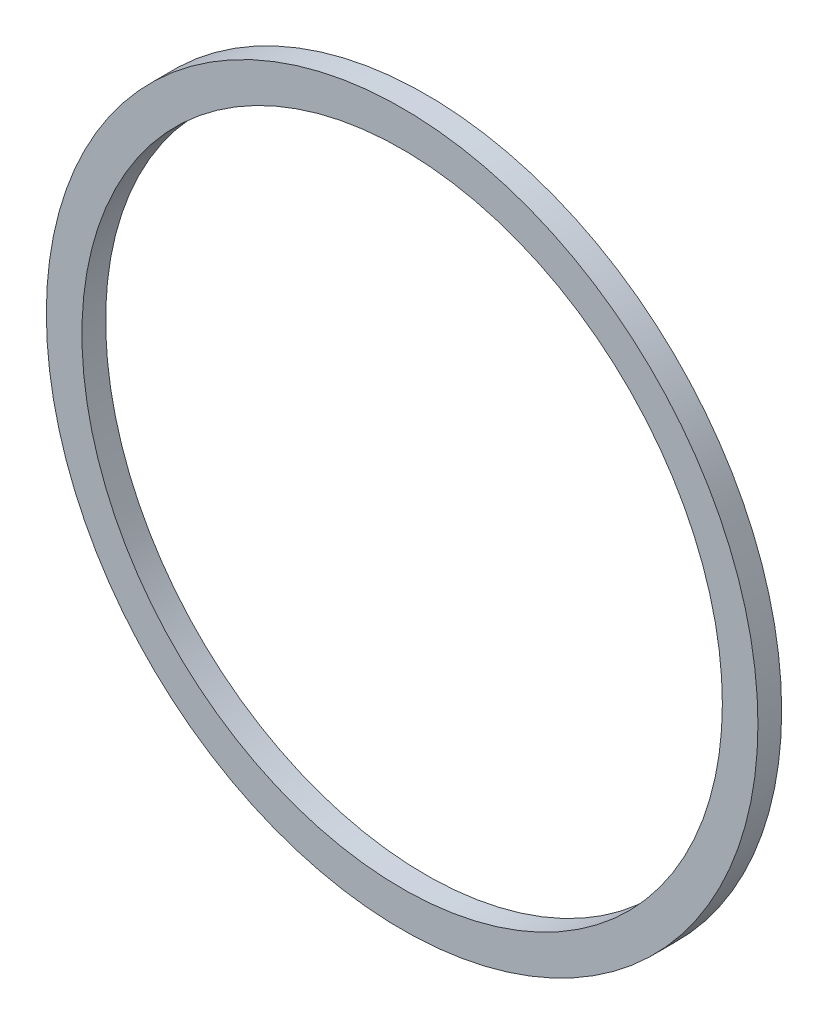
ISO-10303-21;
HEADER;
FILE_DESCRIPTION(('STEP AP214'),'2;1');
FILE_NAME('part.step','',(''),(''),'','','');
FILE_SCHEMA(('AUTOMOTIVE_DESIGN { 1 0 10303 214 1 1 1 1 }'));
ENDSEC;
DATA;
#1=APPLICATION_CONTEXT('core data for automotive mechanical design processes');
#2=APPLICATION_PROTOCOL_DEFINITION('international standard','automotive_design',2000,#1);
#3=PRODUCT_CONTEXT('',#1,'mechanical');
#4=PRODUCT('Part','Part','',(#3));
#5=PRODUCT_RELATED_PRODUCT_CATEGORY('part','',(#4));
#6=PRODUCT_DEFINITION_FORMATION('','',#4);
#7=PRODUCT_DEFINITION_CONTEXT('part definition',#1,'design');
#8=PRODUCT_DEFINITION('design','',#6,#7);
#9=PRODUCT_DEFINITION_SHAPE('','',#8);
#10=(LENGTH_UNIT() NAMED_UNIT(*) SI_UNIT(.MILLI.,.METRE.));
#11=(NAMED_UNIT(*) PLANE_ANGLE_UNIT() SI_UNIT($,.RADIAN.));
#12=(NAMED_UNIT(*) SI_UNIT($,.STERADIAN.) SOLID_ANGLE_UNIT());
#13=UNCERTAINTY_MEASURE_WITH_UNIT(LENGTH_MEASURE(1.E-05),#10,'distance_accuracy_value','');
#14=(GEOMETRIC_REPRESENTATION_CONTEXT(3) GLOBAL_UNCERTAINTY_ASSIGNED_CONTEXT((#13)) GLOBAL_UNIT_ASSIGNED_CONTEXT((#10,
#11,#12)) REPRESENTATION_CONTEXT('',''));
#15=CARTESIAN_POINT('',(0.,0.,0.));
#16=DIRECTION('',(0.,0.,1.));
#17=DIRECTION('',(1.,0.,0.));
#18=AXIS2_PLACEMENT_3D('',#15,#16,#17);
#19=CARTESIAN_POINT('',(0.,0.,5.));
#20=DIRECTION('',(0.,0.,1.));
#21=DIRECTION('',(1.,0.,0.));
#22=AXIS2_PLACEMENT_3D('',#19,#20,#21);
#23=PLANE('',#22);
#24=CARTESIAN_POINT('',(0.,0.,5.));
#25=DIRECTION('',(0.,0.,1.));
#26=DIRECTION('',(1.,0.,0.));
#27=AXIS2_PLACEMENT_3D('',#24,#25,#26);
#28=CIRCLE('',#27,75.);
#29=CARTESIAN_POINT('',(75.,0.,5.));
#30=VERTEX_POINT('',#29);
#31=EDGE_CURVE('E10',#30,#30,#28,.T.);
#32=ORIENTED_EDGE('',*,*,#31,.T.);
#33=EDGE_LOOP('',(#32));
#34=FACE_BOUND('',#33,.T.);
#35=CARTESIAN_POINT('',(0.,0.,5.));
#36=DIRECTION('',(0.,0.,1.));
#37=DIRECTION('',(1.,0.,0.));
#38=AXIS2_PLACEMENT_3D('',#35,#36,#37);
#39=CIRCLE('',#38,67.5);
#40=CARTESIAN_POINT('',(67.5,0.,5.));
#41=VERTEX_POINT('',#40);
#42=EDGE_CURVE('E44',#41,#41,#39,.T.);
#43=ORIENTED_EDGE('',*,*,#42,.F.);
#44=EDGE_LOOP('',(#43));
#45=FACE_BOUND('',#44,.T.);
#46=ADVANCED_FACE('F33',(#34,#45),#23,.T.);
#47=CARTESIAN_POINT('',(0.,0.,0.));
#48=DIRECTION('',(0.,0.,1.));
#49=DIRECTION('',(1.,0.,0.));
#50=AXIS2_PLACEMENT_3D('',#47,#48,#49);
#51=PLANE('',#50);
#52=CARTESIAN_POINT('',(0.,0.,0.));
#53=DIRECTION('',(0.,0.,1.));
#54=DIRECTION('',(1.,0.,0.));
#55=AXIS2_PLACEMENT_3D('',#52,#53,#54);
#56=CIRCLE('',#55,75.);
#57=CARTESIAN_POINT('',(75.,0.,0.));
#58=VERTEX_POINT('',#57);
#59=EDGE_CURVE('E37',#58,#58,#56,.T.);
#60=ORIENTED_EDGE('',*,*,#59,.F.);
#61=EDGE_LOOP('',(#60));
#62=FACE_BOUND('',#61,.T.);
#63=CARTESIAN_POINT('',(0.,0.,0.));
#64=DIRECTION('',(0.,0.,1.));
#65=DIRECTION('',(1.,0.,0.));
#66=AXIS2_PLACEMENT_3D('',#63,#64,#65);
#67=CIRCLE('',#66,67.5);
#68=CARTESIAN_POINT('',(67.5,0.,0.));
#69=VERTEX_POINT('',#68);
#70=EDGE_CURVE('E46',#69,#69,#67,.T.);
#71=ORIENTED_EDGE('',*,*,#70,.T.);
#72=EDGE_LOOP('',(#71));
#73=FACE_BOUND('',#72,.T.);
#74=ADVANCED_FACE('F56',(#62,#73),#51,.F.);
#75=CARTESIAN_POINT('',(0.,0.,5.));
#76=DIRECTION('',(0.,0.,-1.));
#77=DIRECTION('',(-1.,0.,0.));
#78=AXIS2_PLACEMENT_3D('',#75,#76,#77);
#79=CYLINDRICAL_SURFACE('',#78,75.);
#80=ORIENTED_EDGE('',*,*,#31,.F.);
#81=EDGE_LOOP('',(#80));
#82=FACE_BOUND('',#81,.T.);
#83=ORIENTED_EDGE('',*,*,#59,.T.);
#84=EDGE_LOOP('',(#83));
#85=FACE_BOUND('',#84,.T.);
#86=ADVANCED_FACE('F35',(#82,#85),#79,.T.);
#87=CARTESIAN_POINT('',(0.,0.,5.));
#88=DIRECTION('',(0.,0.,-1.));
#89=DIRECTION('',(-1.,0.,0.));
#90=AXIS2_PLACEMENT_3D('',#87,#88,#89);
#91=CYLINDRICAL_SURFACE('',#90,67.5);
#92=ORIENTED_EDGE('',*,*,#42,.T.);
#93=EDGE_LOOP('',(#92));
#94=FACE_BOUND('',#93,.T.);
#95=ORIENTED_EDGE('',*,*,#70,.F.);
#96=EDGE_LOOP('',(#95));
#97=FACE_BOUND('',#96,.T.);
#98=ADVANCED_FACE('F52',(#94,#97),#91,.F.);
#99=CLOSED_SHELL('',(#46,#74,#86,#98));
#100=MANIFOLD_SOLID_BREP('B2',#99);
#101=ADVANCED_BREP_SHAPE_REPRESENTATION('',(#18,#100),#14);
#102=SHAPE_DEFINITION_REPRESENTATION(#9,#101);
ENDSEC;
END-ISO-10303-21;
